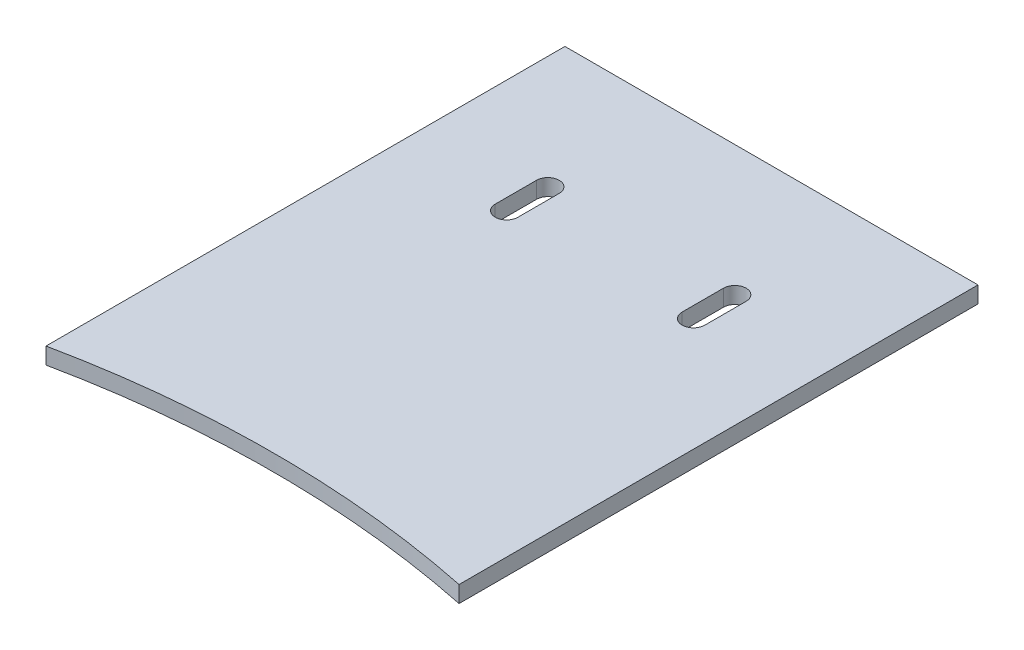
ISO-10303-21;
HEADER;
FILE_DESCRIPTION(('STEP AP214'),'2;1');
FILE_NAME('part.step','',(''),(''),'','','');
FILE_SCHEMA(('AUTOMOTIVE_DESIGN { 1 0 10303 214 1 1 1 1 }'));
ENDSEC;
DATA;
#1=APPLICATION_CONTEXT('core data for automotive mechanical design processes');
#2=APPLICATION_PROTOCOL_DEFINITION('international standard','automotive_design',2000,#1);
#3=PRODUCT_CONTEXT('',#1,'mechanical');
#4=PRODUCT('Part','Part','',(#3));
#5=PRODUCT_RELATED_PRODUCT_CATEGORY('part','',(#4));
#6=PRODUCT_DEFINITION_FORMATION('','',#4);
#7=PRODUCT_DEFINITION_CONTEXT('part definition',#1,'design');
#8=PRODUCT_DEFINITION('design','',#6,#7);
#9=PRODUCT_DEFINITION_SHAPE('','',#8);
#10=(LENGTH_UNIT() NAMED_UNIT(*) SI_UNIT(.MILLI.,.METRE.));
#11=(NAMED_UNIT(*) PLANE_ANGLE_UNIT() SI_UNIT($,.RADIAN.));
#12=(NAMED_UNIT(*) SI_UNIT($,.STERADIAN.) SOLID_ANGLE_UNIT());
#13=UNCERTAINTY_MEASURE_WITH_UNIT(LENGTH_MEASURE(1.E-05),#10,'distance_accuracy_value','');
#14=(GEOMETRIC_REPRESENTATION_CONTEXT(3) GLOBAL_UNCERTAINTY_ASSIGNED_CONTEXT((#13)) GLOBAL_UNIT_ASSIGNED_CONTEXT((#10,
#11,#12)) REPRESENTATION_CONTEXT('',''));
#15=CARTESIAN_POINT('',(0.,0.,0.));
#16=DIRECTION('',(0.,0.,1.));
#17=DIRECTION('',(1.,0.,0.));
#18=AXIS2_PLACEMENT_3D('',#15,#16,#17);
#19=CARTESIAN_POINT('',(0.,16.,-3.5527136788005E-12));
#20=DIRECTION('',(0.,-1.,0.));
#21=DIRECTION('',(0.,0.,-1.));
#22=AXIS2_PLACEMENT_3D('',#19,#20,#21);
#23=PLANE('',#22);
#24=CARTESIAN_POINT('',(-90.5,16.,-1341.5));
#25=DIRECTION('',(0.,1.,0.));
#26=DIRECTION('',(0.,0.,1.));
#27=AXIS2_PLACEMENT_3D('',#24,#25,#26);
#28=CIRCLE('',#27,11.);
#29=CARTESIAN_POINT('',(-79.5,16.,-1341.5));
#30=VERTEX_POINT('',#29);
#31=CARTESIAN_POINT('',(-101.5,16.,-1341.5));
#32=VERTEX_POINT('',#31);
#33=EDGE_CURVE('E161',#30,#32,#28,.T.);
#34=ORIENTED_EDGE('',*,*,#33,.F.);
#35=DIRECTION('',(0.,0.,-1.));
#36=VECTOR('',#35,1.);
#37=CARTESIAN_POINT('',(-79.5,16.,-1341.5));
#38=LINE('',#37,#36);
#39=CARTESIAN_POINT('',(-79.5,16.,-1301.5));
#40=VERTEX_POINT('',#39);
#41=EDGE_CURVE('E169',#40,#30,#38,.T.);
#42=ORIENTED_EDGE('',*,*,#41,.F.);
#43=CARTESIAN_POINT('',(-90.5,16.,-1301.5));
#44=DIRECTION('',(0.,1.,0.));
#45=DIRECTION('',(0.,0.,1.));
#46=AXIS2_PLACEMENT_3D('',#43,#44,#45);
#47=CIRCLE('',#46,11.);
#48=CARTESIAN_POINT('',(-101.5,16.,-1301.5));
#49=VERTEX_POINT('',#48);
#50=EDGE_CURVE('E166',#49,#40,#47,.T.);
#51=ORIENTED_EDGE('',*,*,#50,.F.);
#52=DIRECTION('',(0.,0.,1.));
#53=VECTOR('',#52,1.);
#54=CARTESIAN_POINT('',(-101.5,16.,-1341.5));
#55=LINE('',#54,#53);
#56=EDGE_CURVE('E163',#32,#49,#55,.T.);
#57=ORIENTED_EDGE('',*,*,#56,.F.);
#58=EDGE_LOOP('',(#34,#42,#51,#57));
#59=FACE_BOUND('',#58,.T.);
#60=DIRECTION('',(-1.,0.,0.));
#61=VECTOR('',#60,1.);
#62=CARTESIAN_POINT('',(-200.,16.,-1467.5));
#63=LINE('',#62,#61);
#64=CARTESIAN_POINT('',(200.,16.,-1467.5));
#65=VERTEX_POINT('',#64);
#66=CARTESIAN_POINT('',(-200.,16.,-1467.5));
#67=VERTEX_POINT('',#66);
#68=EDGE_CURVE('E192',#65,#67,#63,.T.);
#69=ORIENTED_EDGE('',*,*,#68,.T.);
#70=DIRECTION('',(0.,0.,1.));
#71=VECTOR('',#70,1.);
#72=CARTESIAN_POINT('',(-200.,16.,-964.99235748269));
#73=LINE('',#72,#71);
#74=CARTESIAN_POINT('',(-200.,16.,-964.99235748269));
#75=VERTEX_POINT('',#74);
#76=EDGE_CURVE('E195',#67,#75,#73,.T.);
#77=ORIENTED_EDGE('',*,*,#76,.T.);
#78=CARTESIAN_POINT('',(0.,16.,-3.5527136788005E-12));
#79=DIRECTION('',(0.,-1.,0.));
#80=DIRECTION('',(0.,0.,-1.));
#81=AXIS2_PLACEMENT_3D('',#78,#79,#80);
#82=CIRCLE('',#81,985.499999999996);
#83=CARTESIAN_POINT('',(200.,16.,-964.99235748269));
#84=VERTEX_POINT('',#83);
#85=EDGE_CURVE('E198',#75,#84,#82,.T.);
#86=ORIENTED_EDGE('',*,*,#85,.T.);
#87=DIRECTION('',(0.,0.,-1.));
#88=VECTOR('',#87,1.);
#89=CARTESIAN_POINT('',(200.,16.,-1467.5));
#90=LINE('',#89,#88);
#91=EDGE_CURVE('E200',#84,#65,#90,.T.);
#92=ORIENTED_EDGE('',*,*,#91,.T.);
#93=EDGE_LOOP('',(#69,#77,#86,#92));
#94=FACE_BOUND('',#93,.T.);
#95=CARTESIAN_POINT('',(90.5,16.,-1301.5));
#96=DIRECTION('',(0.,1.,0.));
#97=DIRECTION('',(0.,0.,1.));
#98=AXIS2_PLACEMENT_3D('',#95,#96,#97);
#99=CIRCLE('',#98,11.);
#100=CARTESIAN_POINT('',(79.5,16.,-1301.5));
#101=VERTEX_POINT('',#100);
#102=CARTESIAN_POINT('',(101.5,16.,-1301.5));
#103=VERTEX_POINT('',#102);
#104=EDGE_CURVE('E125',#101,#103,#99,.T.);
#105=ORIENTED_EDGE('',*,*,#104,.F.);
#106=DIRECTION('',(0.,0.,1.));
#107=VECTOR('',#106,1.);
#108=CARTESIAN_POINT('',(79.5,16.,-1301.5));
#109=LINE('',#108,#107);
#110=CARTESIAN_POINT('',(79.5,16.,-1341.5));
#111=VERTEX_POINT('',#110);
#112=EDGE_CURVE('E147',#111,#101,#109,.T.);
#113=ORIENTED_EDGE('',*,*,#112,.F.);
#114=CARTESIAN_POINT('',(90.5,16.,-1341.5));
#115=DIRECTION('',(0.,1.,0.));
#116=DIRECTION('',(0.,0.,1.));
#117=AXIS2_PLACEMENT_3D('',#114,#115,#116);
#118=CIRCLE('',#117,11.);
#119=CARTESIAN_POINT('',(101.5,16.,-1341.5));
#120=VERTEX_POINT('',#119);
#121=EDGE_CURVE('E145',#120,#111,#118,.T.);
#122=ORIENTED_EDGE('',*,*,#121,.F.);
#123=DIRECTION('',(0.,0.,-1.));
#124=VECTOR('',#123,1.);
#125=CARTESIAN_POINT('',(101.5,16.,-1301.5));
#126=LINE('',#125,#124);
#127=EDGE_CURVE('E133',#103,#120,#126,.T.);
#128=ORIENTED_EDGE('',*,*,#127,.F.);
#129=EDGE_LOOP('',(#105,#113,#122,#128));
#130=FACE_BOUND('',#129,.T.);
#131=ADVANCED_FACE('F36',(#59,#94,#130),#23,.F.);
#132=CARTESIAN_POINT('',(0.,0.,-3.5527136788005E-12));
#133=DIRECTION('',(0.,-1.,0.));
#134=DIRECTION('',(0.,0.,-1.));
#135=AXIS2_PLACEMENT_3D('',#132,#133,#134);
#136=PLANE('',#135);
#137=DIRECTION('',(-1.,0.,0.));
#138=VECTOR('',#137,1.);
#139=CARTESIAN_POINT('',(-200.,0.,-1467.5));
#140=LINE('',#139,#138);
#141=CARTESIAN_POINT('',(200.,0.,-1467.5));
#142=VERTEX_POINT('',#141);
#143=CARTESIAN_POINT('',(-200.,0.,-1467.5));
#144=VERTEX_POINT('',#143);
#145=EDGE_CURVE('E191',#142,#144,#140,.T.);
#146=ORIENTED_EDGE('',*,*,#145,.F.);
#147=DIRECTION('',(0.,0.,-1.));
#148=VECTOR('',#147,1.);
#149=CARTESIAN_POINT('',(200.,0.,-1467.5));
#150=LINE('',#149,#148);
#151=CARTESIAN_POINT('',(200.,0.,-964.99235748269));
#152=VERTEX_POINT('',#151);
#153=EDGE_CURVE('E196',#152,#142,#150,.T.);
#154=ORIENTED_EDGE('',*,*,#153,.F.);
#155=CARTESIAN_POINT('',(0.,0.,-3.5527136788005E-12));
#156=DIRECTION('',(0.,-1.,0.));
#157=DIRECTION('',(0.,0.,-1.));
#158=AXIS2_PLACEMENT_3D('',#155,#156,#157);
#159=CIRCLE('',#158,985.499999999996);
#160=CARTESIAN_POINT('',(-200.,0.,-964.99235748269));
#161=VERTEX_POINT('',#160);
#162=EDGE_CURVE('E207',#161,#152,#159,.T.);
#163=ORIENTED_EDGE('',*,*,#162,.F.);
#164=DIRECTION('',(0.,0.,1.));
#165=VECTOR('',#164,1.);
#166=CARTESIAN_POINT('',(-200.,0.,-964.99235748269));
#167=LINE('',#166,#165);
#168=EDGE_CURVE('E205',#144,#161,#167,.T.);
#169=ORIENTED_EDGE('',*,*,#168,.F.);
#170=EDGE_LOOP('',(#146,#154,#163,#169));
#171=FACE_BOUND('',#170,.T.);
#172=DIRECTION('',(0.,0.,-1.));
#173=VECTOR('',#172,1.);
#174=CARTESIAN_POINT('',(-79.5,0.,-1341.5));
#175=LINE('',#174,#173);
#176=CARTESIAN_POINT('',(-79.5,0.,-1301.5));
#177=VERTEX_POINT('',#176);
#178=CARTESIAN_POINT('',(-79.5,0.,-1341.5));
#179=VERTEX_POINT('',#178);
#180=EDGE_CURVE('E164',#177,#179,#175,.T.);
#181=ORIENTED_EDGE('',*,*,#180,.T.);
#182=CARTESIAN_POINT('',(-90.5,0.,-1341.5));
#183=DIRECTION('',(0.,1.,0.));
#184=DIRECTION('',(0.,0.,1.));
#185=AXIS2_PLACEMENT_3D('',#182,#183,#184);
#186=CIRCLE('',#185,11.);
#187=CARTESIAN_POINT('',(-101.5,0.,-1341.5));
#188=VERTEX_POINT('',#187);
#189=EDGE_CURVE('E141',#179,#188,#186,.T.);
#190=ORIENTED_EDGE('',*,*,#189,.T.);
#191=DIRECTION('',(0.,0.,1.));
#192=VECTOR('',#191,1.);
#193=CARTESIAN_POINT('',(-101.5,0.,-1341.5));
#194=LINE('',#193,#192);
#195=CARTESIAN_POINT('',(-101.5,0.,-1301.5));
#196=VERTEX_POINT('',#195);
#197=EDGE_CURVE('E174',#188,#196,#194,.T.);
#198=ORIENTED_EDGE('',*,*,#197,.T.);
#199=CARTESIAN_POINT('',(-90.5,0.,-1301.5));
#200=DIRECTION('',(0.,1.,0.));
#201=DIRECTION('',(0.,0.,1.));
#202=AXIS2_PLACEMENT_3D('',#199,#200,#201);
#203=CIRCLE('',#202,11.);
#204=EDGE_CURVE('E177',#196,#177,#203,.T.);
#205=ORIENTED_EDGE('',*,*,#204,.T.);
#206=EDGE_LOOP('',(#181,#190,#198,#205));
#207=FACE_BOUND('',#206,.T.);
#208=DIRECTION('',(0.,0.,1.));
#209=VECTOR('',#208,1.);
#210=CARTESIAN_POINT('',(79.5,0.,-1301.5));
#211=LINE('',#210,#209);
#212=CARTESIAN_POINT('',(79.5,0.,-1341.5));
#213=VERTEX_POINT('',#212);
#214=CARTESIAN_POINT('',(79.5,0.,-1301.5));
#215=VERTEX_POINT('',#214);
#216=EDGE_CURVE('E134',#213,#215,#211,.T.);
#217=ORIENTED_EDGE('',*,*,#216,.T.);
#218=CARTESIAN_POINT('',(90.5,0.,-1301.5));
#219=DIRECTION('',(0.,1.,0.));
#220=DIRECTION('',(0.,0.,1.));
#221=AXIS2_PLACEMENT_3D('',#218,#219,#220);
#222=CIRCLE('',#221,11.);
#223=CARTESIAN_POINT('',(101.5,0.,-1301.5));
#224=VERTEX_POINT('',#223);
#225=EDGE_CURVE('E59',#215,#224,#222,.T.);
#226=ORIENTED_EDGE('',*,*,#225,.T.);
#227=DIRECTION('',(0.,0.,-1.));
#228=VECTOR('',#227,1.);
#229=CARTESIAN_POINT('',(101.5,0.,-1301.5));
#230=LINE('',#229,#228);
#231=CARTESIAN_POINT('',(101.5,0.,-1341.5));
#232=VERTEX_POINT('',#231);
#233=EDGE_CURVE('E140',#224,#232,#230,.T.);
#234=ORIENTED_EDGE('',*,*,#233,.T.);
#235=CARTESIAN_POINT('',(90.5,0.,-1341.5));
#236=DIRECTION('',(0.,1.,0.));
#237=DIRECTION('',(0.,0.,1.));
#238=AXIS2_PLACEMENT_3D('',#235,#236,#237);
#239=CIRCLE('',#238,11.);
#240=EDGE_CURVE('E153',#232,#213,#239,.T.);
#241=ORIENTED_EDGE('',*,*,#240,.T.);
#242=EDGE_LOOP('',(#217,#226,#234,#241));
#243=FACE_BOUND('',#242,.T.);
#244=ADVANCED_FACE('F225',(#171,#207,#243),#136,.T.);
#245=CARTESIAN_POINT('',(-200.,16.,-1467.5));
#246=DIRECTION('',(0.,0.,1.));
#247=DIRECTION('',(1.,0.,0.));
#248=AXIS2_PLACEMENT_3D('',#245,#246,#247);
#249=PLANE('',#248);
#250=ORIENTED_EDGE('',*,*,#145,.T.);
#251=DIRECTION('',(0.,-1.,0.));
#252=VECTOR('',#251,1.);
#253=CARTESIAN_POINT('',(-200.,16.,-1467.5));
#254=LINE('',#253,#252);
#255=EDGE_CURVE('E11',#67,#144,#254,.T.);
#256=ORIENTED_EDGE('',*,*,#255,.F.);
#257=ORIENTED_EDGE('',*,*,#68,.F.);
#258=DIRECTION('',(0.,-1.,0.));
#259=VECTOR('',#258,1.);
#260=CARTESIAN_POINT('',(200.,16.,-1467.5));
#261=LINE('',#260,#259);
#262=EDGE_CURVE('E202',#65,#142,#261,.T.);
#263=ORIENTED_EDGE('',*,*,#262,.T.);
#264=EDGE_LOOP('',(#250,#256,#257,#263));
#265=FACE_BOUND('',#264,.T.);
#266=ADVANCED_FACE('F38',(#265),#249,.F.);
#267=CARTESIAN_POINT('',(-200.,16.,-964.99235748269));
#268=DIRECTION('',(1.,0.,0.));
#269=DIRECTION('',(0.,0.,-1.));
#270=AXIS2_PLACEMENT_3D('',#267,#268,#269);
#271=PLANE('',#270);
#272=ORIENTED_EDGE('',*,*,#168,.T.);
#273=DIRECTION('',(0.,-1.,0.));
#274=VECTOR('',#273,1.);
#275=CARTESIAN_POINT('',(-200.,16.,-964.99235748269));
#276=LINE('',#275,#274);
#277=EDGE_CURVE('E44',#75,#161,#276,.T.);
#278=ORIENTED_EDGE('',*,*,#277,.F.);
#279=ORIENTED_EDGE('',*,*,#76,.F.);
#280=ORIENTED_EDGE('',*,*,#255,.T.);
#281=EDGE_LOOP('',(#272,#278,#279,#280));
#282=FACE_BOUND('',#281,.T.);
#283=ADVANCED_FACE('F235',(#282),#271,.F.);
#284=CARTESIAN_POINT('',(0.,16.,-3.5527136788005E-12));
#285=DIRECTION('',(0.,-1.,0.));
#286=DIRECTION('',(0.,0.,-1.));
#287=AXIS2_PLACEMENT_3D('',#284,#285,#286);
#288=CYLINDRICAL_SURFACE('',#287,985.499999999996);
#289=ORIENTED_EDGE('',*,*,#162,.T.);
#290=DIRECTION('',(0.,-1.,0.));
#291=VECTOR('',#290,1.);
#292=CARTESIAN_POINT('',(200.,16.,-964.99235748269));
#293=LINE('',#292,#291);
#294=EDGE_CURVE('E212',#84,#152,#293,.T.);
#295=ORIENTED_EDGE('',*,*,#294,.F.);
#296=ORIENTED_EDGE('',*,*,#85,.F.);
#297=ORIENTED_EDGE('',*,*,#277,.T.);
#298=EDGE_LOOP('',(#289,#295,#296,#297));
#299=FACE_BOUND('',#298,.T.);
#300=ADVANCED_FACE('F219',(#299),#288,.F.);
#301=CARTESIAN_POINT('',(200.,16.,-1467.5));
#302=DIRECTION('',(-1.,0.,0.));
#303=DIRECTION('',(0.,0.,1.));
#304=AXIS2_PLACEMENT_3D('',#301,#302,#303);
#305=PLANE('',#304);
#306=ORIENTED_EDGE('',*,*,#153,.T.);
#307=ORIENTED_EDGE('',*,*,#262,.F.);
#308=ORIENTED_EDGE('',*,*,#91,.F.);
#309=ORIENTED_EDGE('',*,*,#294,.T.);
#310=EDGE_LOOP('',(#306,#307,#308,#309));
#311=FACE_BOUND('',#310,.T.);
#312=ADVANCED_FACE('F229',(#311),#305,.F.);
#313=CARTESIAN_POINT('',(-90.5,16.,-1341.5));
#314=DIRECTION('',(0.,-1.,0.));
#315=DIRECTION('',(0.,0.,-1.));
#316=AXIS2_PLACEMENT_3D('',#313,#314,#315);
#317=CYLINDRICAL_SURFACE('',#316,11.);
#318=ORIENTED_EDGE('',*,*,#189,.F.);
#319=DIRECTION('',(0.,-1.,0.));
#320=VECTOR('',#319,1.);
#321=CARTESIAN_POINT('',(-79.5,16.,-1341.5));
#322=LINE('',#321,#320);
#323=EDGE_CURVE('E171',#30,#179,#322,.T.);
#324=ORIENTED_EDGE('',*,*,#323,.F.);
#325=ORIENTED_EDGE('',*,*,#33,.T.);
#326=DIRECTION('',(0.,-1.,0.));
#327=VECTOR('',#326,1.);
#328=CARTESIAN_POINT('',(-101.5,16.,-1341.5));
#329=LINE('',#328,#327);
#330=EDGE_CURVE('E188',#32,#188,#329,.T.);
#331=ORIENTED_EDGE('',*,*,#330,.T.);
#332=EDGE_LOOP('',(#318,#324,#325,#331));
#333=FACE_BOUND('',#332,.T.);
#334=ADVANCED_FACE('F251',(#333),#317,.F.);
#335=CARTESIAN_POINT('',(-101.5,16.,-1341.5));
#336=DIRECTION('',(1.,0.,0.));
#337=DIRECTION('',(0.,0.,-1.));
#338=AXIS2_PLACEMENT_3D('',#335,#336,#337);
#339=PLANE('',#338);
#340=ORIENTED_EDGE('',*,*,#197,.F.);
#341=ORIENTED_EDGE('',*,*,#330,.F.);
#342=ORIENTED_EDGE('',*,*,#56,.T.);
#343=DIRECTION('',(0.,-1.,0.));
#344=VECTOR('',#343,1.);
#345=CARTESIAN_POINT('',(-101.5,16.,-1301.5));
#346=LINE('',#345,#344);
#347=EDGE_CURVE('E186',#49,#196,#346,.T.);
#348=ORIENTED_EDGE('',*,*,#347,.T.);
#349=EDGE_LOOP('',(#340,#341,#342,#348));
#350=FACE_BOUND('',#349,.T.);
#351=ADVANCED_FACE('F258',(#350),#339,.T.);
#352=CARTESIAN_POINT('',(-90.5,16.,-1301.5));
#353=DIRECTION('',(0.,-1.,0.));
#354=DIRECTION('',(0.,0.,-1.));
#355=AXIS2_PLACEMENT_3D('',#352,#353,#354);
#356=CYLINDRICAL_SURFACE('',#355,11.);
#357=ORIENTED_EDGE('',*,*,#204,.F.);
#358=ORIENTED_EDGE('',*,*,#347,.F.);
#359=ORIENTED_EDGE('',*,*,#50,.T.);
#360=DIRECTION('',(0.,-1.,0.));
#361=VECTOR('',#360,1.);
#362=CARTESIAN_POINT('',(-79.5,16.,-1301.5));
#363=LINE('',#362,#361);
#364=EDGE_CURVE('E184',#40,#177,#363,.T.);
#365=ORIENTED_EDGE('',*,*,#364,.T.);
#366=EDGE_LOOP('',(#357,#358,#359,#365));
#367=FACE_BOUND('',#366,.T.);
#368=ADVANCED_FACE('F263',(#367),#356,.F.);
#369=CARTESIAN_POINT('',(-79.5,16.,-1341.5));
#370=DIRECTION('',(-1.,0.,0.));
#371=DIRECTION('',(0.,0.,1.));
#372=AXIS2_PLACEMENT_3D('',#369,#370,#371);
#373=PLANE('',#372);
#374=ORIENTED_EDGE('',*,*,#180,.F.);
#375=ORIENTED_EDGE('',*,*,#364,.F.);
#376=ORIENTED_EDGE('',*,*,#41,.T.);
#377=ORIENTED_EDGE('',*,*,#323,.T.);
#378=EDGE_LOOP('',(#374,#375,#376,#377));
#379=FACE_BOUND('',#378,.T.);
#380=ADVANCED_FACE('F269',(#379),#373,.T.);
#381=CARTESIAN_POINT('',(90.5,16.,-1301.5));
#382=DIRECTION('',(0.,-1.,0.));
#383=DIRECTION('',(0.,0.,-1.));
#384=AXIS2_PLACEMENT_3D('',#381,#382,#383);
#385=CYLINDRICAL_SURFACE('',#384,11.);
#386=ORIENTED_EDGE('',*,*,#225,.F.);
#387=DIRECTION('',(0.,-1.,0.));
#388=VECTOR('',#387,1.);
#389=CARTESIAN_POINT('',(79.5,16.,-1301.5));
#390=LINE('',#389,#388);
#391=EDGE_CURVE('E129',#101,#215,#390,.T.);
#392=ORIENTED_EDGE('',*,*,#391,.F.);
#393=ORIENTED_EDGE('',*,*,#104,.T.);
#394=DIRECTION('',(0.,-1.,0.));
#395=VECTOR('',#394,1.);
#396=CARTESIAN_POINT('',(101.5,16.,-1301.5));
#397=LINE('',#396,#395);
#398=EDGE_CURVE('E128',#103,#224,#397,.T.);
#399=ORIENTED_EDGE('',*,*,#398,.T.);
#400=EDGE_LOOP('',(#386,#392,#393,#399));
#401=FACE_BOUND('',#400,.T.);
#402=ADVANCED_FACE('F127',(#401),#385,.F.);
#403=CARTESIAN_POINT('',(101.5,16.,-1301.5));
#404=DIRECTION('',(-1.,0.,0.));
#405=DIRECTION('',(0.,0.,1.));
#406=AXIS2_PLACEMENT_3D('',#403,#404,#405);
#407=PLANE('',#406);
#408=ORIENTED_EDGE('',*,*,#233,.F.);
#409=ORIENTED_EDGE('',*,*,#398,.F.);
#410=ORIENTED_EDGE('',*,*,#127,.T.);
#411=DIRECTION('',(0.,-1.,0.));
#412=VECTOR('',#411,1.);
#413=CARTESIAN_POINT('',(101.5,16.,-1341.5));
#414=LINE('',#413,#412);
#415=EDGE_CURVE('E142',#120,#232,#414,.T.);
#416=ORIENTED_EDGE('',*,*,#415,.T.);
#417=EDGE_LOOP('',(#408,#409,#410,#416));
#418=FACE_BOUND('',#417,.T.);
#419=ADVANCED_FACE('F137',(#418),#407,.T.);
#420=CARTESIAN_POINT('',(90.5,16.,-1341.5));
#421=DIRECTION('',(0.,-1.,0.));
#422=DIRECTION('',(0.,0.,-1.));
#423=AXIS2_PLACEMENT_3D('',#420,#421,#422);
#424=CYLINDRICAL_SURFACE('',#423,11.);
#425=ORIENTED_EDGE('',*,*,#240,.F.);
#426=ORIENTED_EDGE('',*,*,#415,.F.);
#427=ORIENTED_EDGE('',*,*,#121,.T.);
#428=DIRECTION('',(0.,-1.,0.));
#429=VECTOR('',#428,1.);
#430=CARTESIAN_POINT('',(79.5,16.,-1341.5));
#431=LINE('',#430,#429);
#432=EDGE_CURVE('E51',#111,#213,#431,.T.);
#433=ORIENTED_EDGE('',*,*,#432,.T.);
#434=EDGE_LOOP('',(#425,#426,#427,#433));
#435=FACE_BOUND('',#434,.T.);
#436=ADVANCED_FACE('F288',(#435),#424,.F.);
#437=CARTESIAN_POINT('',(79.5,16.,-1301.5));
#438=DIRECTION('',(1.,0.,0.));
#439=DIRECTION('',(0.,0.,-1.));
#440=AXIS2_PLACEMENT_3D('',#437,#438,#439);
#441=PLANE('',#440);
#442=ORIENTED_EDGE('',*,*,#216,.F.);
#443=ORIENTED_EDGE('',*,*,#432,.F.);
#444=ORIENTED_EDGE('',*,*,#112,.T.);
#445=ORIENTED_EDGE('',*,*,#391,.T.);
#446=EDGE_LOOP('',(#442,#443,#444,#445));
#447=FACE_BOUND('',#446,.T.);
#448=ADVANCED_FACE('F291',(#447),#441,.T.);
#449=CLOSED_SHELL('',(#131,#244,#266,#283,#300,#312,#334,#351,#368,#380,#402,#419,#436,#448));
#450=MANIFOLD_SOLID_BREP('B2',#449);
#451=ADVANCED_BREP_SHAPE_REPRESENTATION('',(#18,#450),#14);
#452=SHAPE_DEFINITION_REPRESENTATION(#9,#451);
ENDSEC;
END-ISO-10303-21;
